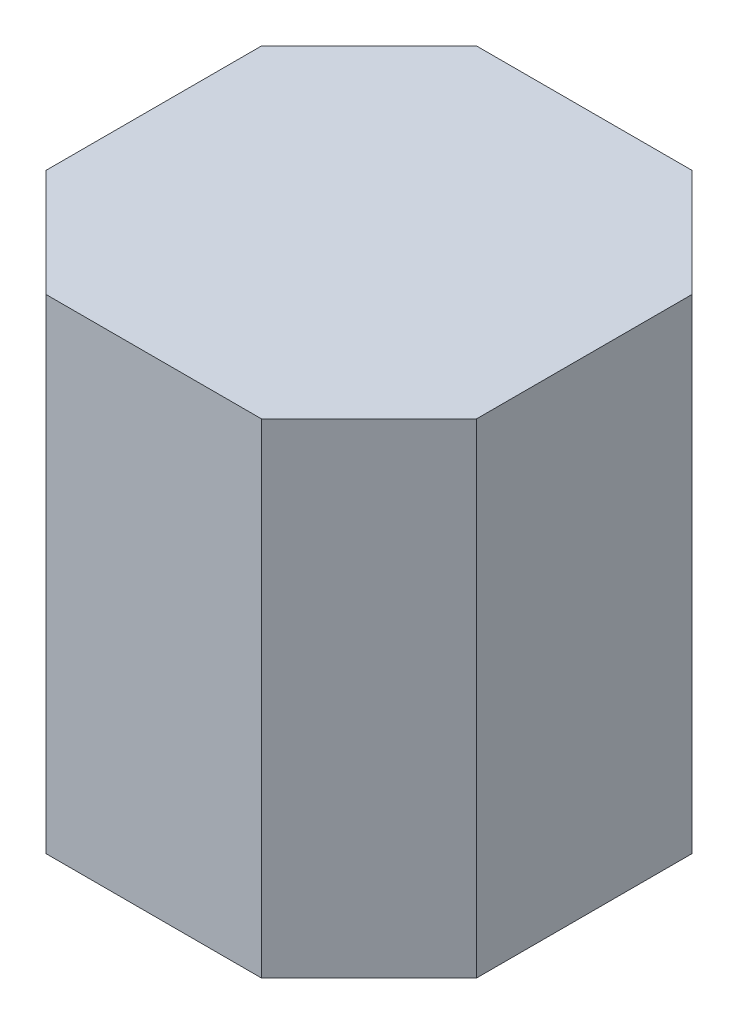
ISO-10303-21;
HEADER;
FILE_DESCRIPTION(('STEP AP214'),'2;1');
FILE_NAME('part.step','',(''),(''),'','','');
FILE_SCHEMA(('AUTOMOTIVE_DESIGN { 1 0 10303 214 1 1 1 1 }'));
ENDSEC;
DATA;
#1=APPLICATION_CONTEXT('core data for automotive mechanical design processes');
#2=APPLICATION_PROTOCOL_DEFINITION('international standard','automotive_design',2000,#1);
#3=PRODUCT_CONTEXT('',#1,'mechanical');
#4=PRODUCT('Part','Part','',(#3));
#5=PRODUCT_RELATED_PRODUCT_CATEGORY('part','',(#4));
#6=PRODUCT_DEFINITION_FORMATION('','',#4);
#7=PRODUCT_DEFINITION_CONTEXT('part definition',#1,'design');
#8=PRODUCT_DEFINITION('design','',#6,#7);
#9=PRODUCT_DEFINITION_SHAPE('','',#8);
#10=(LENGTH_UNIT() NAMED_UNIT(*) SI_UNIT(.MILLI.,.METRE.));
#11=(NAMED_UNIT(*) PLANE_ANGLE_UNIT() SI_UNIT($,.RADIAN.));
#12=(NAMED_UNIT(*) SI_UNIT($,.STERADIAN.) SOLID_ANGLE_UNIT());
#13=UNCERTAINTY_MEASURE_WITH_UNIT(LENGTH_MEASURE(1.E-05),#10,'distance_accuracy_value','');
#14=(GEOMETRIC_REPRESENTATION_CONTEXT(3) GLOBAL_UNCERTAINTY_ASSIGNED_CONTEXT((#13)) GLOBAL_UNIT_ASSIGNED_CONTEXT((#10,
#11,#12)) REPRESENTATION_CONTEXT('',''));
#15=CARTESIAN_POINT('',(0.,0.,0.));
#16=DIRECTION('',(0.,0.,1.));
#17=DIRECTION('',(1.,0.,0.));
#18=AXIS2_PLACEMENT_3D('',#15,#16,#17);
#19=CARTESIAN_POINT('',(-40.,90.,20.));
#20=DIRECTION('',(1.,0.,0.));
#21=DIRECTION('',(0.,0.,-1.));
#22=AXIS2_PLACEMENT_3D('',#19,#20,#21);
#23=PLANE('',#22);
#24=DIRECTION('',(0.,0.,1.));
#25=VECTOR('',#24,1.);
#26=CARTESIAN_POINT('',(-40.,0.,20.));
#27=LINE('',#26,#25);
#28=CARTESIAN_POINT('',(-40.,0.,-20.));
#29=VERTEX_POINT('',#28);
#30=CARTESIAN_POINT('',(-40.,0.,20.));
#31=VERTEX_POINT('',#30);
#32=EDGE_CURVE('E135',#29,#31,#27,.T.);
#33=ORIENTED_EDGE('',*,*,#32,.T.);
#34=DIRECTION('',(0.,-1.,0.));
#35=VECTOR('',#34,1.);
#36=CARTESIAN_POINT('',(-40.,90.,20.));
#37=LINE('',#36,#35);
#38=CARTESIAN_POINT('',(-40.,90.,20.));
#39=VERTEX_POINT('',#38);
#40=EDGE_CURVE('E11',#39,#31,#37,.T.);
#41=ORIENTED_EDGE('',*,*,#40,.F.);
#42=DIRECTION('',(0.,0.,1.));
#43=VECTOR('',#42,1.);
#44=CARTESIAN_POINT('',(-40.,90.,20.));
#45=LINE('',#44,#43);
#46=CARTESIAN_POINT('',(-40.,90.,-20.));
#47=VERTEX_POINT('',#46);
#48=EDGE_CURVE('E150',#47,#39,#45,.T.);
#49=ORIENTED_EDGE('',*,*,#48,.F.);
#50=DIRECTION('',(0.,-1.,0.));
#51=VECTOR('',#50,1.);
#52=CARTESIAN_POINT('',(-40.,90.,-20.));
#53=LINE('',#52,#51);
#54=EDGE_CURVE('E131',#47,#29,#53,.T.);
#55=ORIENTED_EDGE('',*,*,#54,.T.);
#56=EDGE_LOOP('',(#33,#41,#49,#55));
#57=FACE_BOUND('',#56,.T.);
#58=ADVANCED_FACE('F39',(#57),#23,.F.);
#59=CARTESIAN_POINT('',(-20.,90.,40.));
#60=DIRECTION('',(0.707106781186547,0.,-0.707106781186547));
#61=DIRECTION('',(-0.707106781186548,0.,-0.707106781186548));
#62=AXIS2_PLACEMENT_3D('',#59,#60,#61);
#63=PLANE('',#62);
#64=DIRECTION('',(0.707106781186548,0.,0.707106781186548));
#65=VECTOR('',#64,1.);
#66=CARTESIAN_POINT('',(-20.,0.,40.));
#67=LINE('',#66,#65);
#68=CARTESIAN_POINT('',(-20.,0.,40.));
#69=VERTEX_POINT('',#68);
#70=EDGE_CURVE('E138',#31,#69,#67,.T.);
#71=ORIENTED_EDGE('',*,*,#70,.T.);
#72=DIRECTION('',(0.,-1.,0.));
#73=VECTOR('',#72,1.);
#74=CARTESIAN_POINT('',(-20.,90.,40.));
#75=LINE('',#74,#73);
#76=CARTESIAN_POINT('',(-20.,90.,40.));
#77=VERTEX_POINT('',#76);
#78=EDGE_CURVE('E47',#77,#69,#75,.T.);
#79=ORIENTED_EDGE('',*,*,#78,.F.);
#80=DIRECTION('',(0.707106781186548,0.,0.707106781186548));
#81=VECTOR('',#80,1.);
#82=CARTESIAN_POINT('',(-20.,90.,40.));
#83=LINE('',#82,#81);
#84=EDGE_CURVE('E98',#39,#77,#83,.T.);
#85=ORIENTED_EDGE('',*,*,#84,.F.);
#86=ORIENTED_EDGE('',*,*,#40,.T.);
#87=EDGE_LOOP('',(#71,#79,#85,#86));
#88=FACE_BOUND('',#87,.T.);
#89=ADVANCED_FACE('F247',(#88),#63,.F.);
#90=CARTESIAN_POINT('',(20.,90.,40.));
#91=DIRECTION('',(0.,0.,-1.));
#92=DIRECTION('',(-1.,0.,0.));
#93=AXIS2_PLACEMENT_3D('',#90,#91,#92);
#94=PLANE('',#93);
#95=DIRECTION('',(1.,0.,0.));
#96=VECTOR('',#95,1.);
#97=CARTESIAN_POINT('',(20.,0.,40.));
#98=LINE('',#97,#96);
#99=CARTESIAN_POINT('',(20.,0.,40.));
#100=VERTEX_POINT('',#99);
#101=EDGE_CURVE('E141',#69,#100,#98,.T.);
#102=ORIENTED_EDGE('',*,*,#101,.T.);
#103=DIRECTION('',(0.,-1.,0.));
#104=VECTOR('',#103,1.);
#105=CARTESIAN_POINT('',(20.,90.,40.));
#106=LINE('',#105,#104);
#107=CARTESIAN_POINT('',(20.,90.,40.));
#108=VERTEX_POINT('',#107);
#109=EDGE_CURVE('E157',#108,#100,#106,.T.);
#110=ORIENTED_EDGE('',*,*,#109,.F.);
#111=DIRECTION('',(1.,0.,0.));
#112=VECTOR('',#111,1.);
#113=CARTESIAN_POINT('',(20.,90.,40.));
#114=LINE('',#113,#112);
#115=EDGE_CURVE('E165',#77,#108,#114,.T.);
#116=ORIENTED_EDGE('',*,*,#115,.F.);
#117=ORIENTED_EDGE('',*,*,#78,.T.);
#118=EDGE_LOOP('',(#102,#110,#116,#117));
#119=FACE_BOUND('',#118,.T.);
#120=ADVANCED_FACE('F163',(#119),#94,.F.);
#121=CARTESIAN_POINT('',(20.,90.,40.));
#122=DIRECTION('',(-0.707106781186547,0.,-0.707106781186547));
#123=DIRECTION('',(-0.707106781186548,0.,0.707106781186548));
#124=AXIS2_PLACEMENT_3D('',#121,#122,#123);
#125=PLANE('',#124);
#126=DIRECTION('',(0.707106781186548,0.,-0.707106781186548));
#127=VECTOR('',#126,1.);
#128=CARTESIAN_POINT('',(20.,0.,40.));
#129=LINE('',#128,#127);
#130=CARTESIAN_POINT('',(40.,0.,20.));
#131=VERTEX_POINT('',#130);
#132=EDGE_CURVE('E143',#100,#131,#129,.T.);
#133=ORIENTED_EDGE('',*,*,#132,.T.);
#134=DIRECTION('',(0.,-1.,0.));
#135=VECTOR('',#134,1.);
#136=CARTESIAN_POINT('',(40.,90.,20.));
#137=LINE('',#136,#135);
#138=CARTESIAN_POINT('',(40.,90.,20.));
#139=VERTEX_POINT('',#138);
#140=EDGE_CURVE('E154',#139,#131,#137,.T.);
#141=ORIENTED_EDGE('',*,*,#140,.F.);
#142=DIRECTION('',(0.707106781186548,0.,-0.707106781186548));
#143=VECTOR('',#142,1.);
#144=CARTESIAN_POINT('',(20.,90.,40.));
#145=LINE('',#144,#143);
#146=EDGE_CURVE('E177',#108,#139,#145,.T.);
#147=ORIENTED_EDGE('',*,*,#146,.F.);
#148=ORIENTED_EDGE('',*,*,#109,.T.);
#149=EDGE_LOOP('',(#133,#141,#147,#148));
#150=FACE_BOUND('',#149,.T.);
#151=ADVANCED_FACE('F173',(#150),#125,.F.);
#152=CARTESIAN_POINT('',(40.,90.,-20.));
#153=DIRECTION('',(-1.,0.,0.));
#154=DIRECTION('',(0.,0.,1.));
#155=AXIS2_PLACEMENT_3D('',#152,#153,#154);
#156=PLANE('',#155);
#157=DIRECTION('',(0.,0.,-1.));
#158=VECTOR('',#157,1.);
#159=CARTESIAN_POINT('',(40.,0.,-20.));
#160=LINE('',#159,#158);
#161=CARTESIAN_POINT('',(40.,0.,-20.));
#162=VERTEX_POINT('',#161);
#163=EDGE_CURVE('E145',#131,#162,#160,.T.);
#164=ORIENTED_EDGE('',*,*,#163,.T.);
#165=DIRECTION('',(0.,-1.,0.));
#166=VECTOR('',#165,1.);
#167=CARTESIAN_POINT('',(40.,90.,-20.));
#168=LINE('',#167,#166);
#169=CARTESIAN_POINT('',(40.,90.,-20.));
#170=VERTEX_POINT('',#169);
#171=EDGE_CURVE('E126',#170,#162,#168,.T.);
#172=ORIENTED_EDGE('',*,*,#171,.F.);
#173=DIRECTION('',(0.,0.,-1.));
#174=VECTOR('',#173,1.);
#175=CARTESIAN_POINT('',(40.,90.,-20.));
#176=LINE('',#175,#174);
#177=EDGE_CURVE('E117',#139,#170,#176,.T.);
#178=ORIENTED_EDGE('',*,*,#177,.F.);
#179=ORIENTED_EDGE('',*,*,#140,.T.);
#180=EDGE_LOOP('',(#164,#172,#178,#179));
#181=FACE_BOUND('',#180,.T.);
#182=ADVANCED_FACE('F176',(#181),#156,.F.);
#183=CARTESIAN_POINT('',(20.,90.,-40.));
#184=DIRECTION('',(-0.707106781186547,0.,0.707106781186547));
#185=DIRECTION('',(0.707106781186548,0.,0.707106781186548));
#186=AXIS2_PLACEMENT_3D('',#183,#184,#185);
#187=PLANE('',#186);
#188=DIRECTION('',(-0.707106781186548,0.,-0.707106781186548));
#189=VECTOR('',#188,1.);
#190=CARTESIAN_POINT('',(20.,0.,-40.));
#191=LINE('',#190,#189);
#192=CARTESIAN_POINT('',(20.,0.,-40.));
#193=VERTEX_POINT('',#192);
#194=EDGE_CURVE('E125',#162,#193,#191,.T.);
#195=ORIENTED_EDGE('',*,*,#194,.T.);
#196=DIRECTION('',(0.,-1.,0.));
#197=VECTOR('',#196,1.);
#198=CARTESIAN_POINT('',(20.,90.,-40.));
#199=LINE('',#198,#197);
#200=CARTESIAN_POINT('',(20.,90.,-40.));
#201=VERTEX_POINT('',#200);
#202=EDGE_CURVE('E122',#201,#193,#199,.T.);
#203=ORIENTED_EDGE('',*,*,#202,.F.);
#204=DIRECTION('',(-0.707106781186548,0.,-0.707106781186548));
#205=VECTOR('',#204,1.);
#206=CARTESIAN_POINT('',(20.,90.,-40.));
#207=LINE('',#206,#205);
#208=EDGE_CURVE('E111',#170,#201,#207,.T.);
#209=ORIENTED_EDGE('',*,*,#208,.F.);
#210=ORIENTED_EDGE('',*,*,#171,.T.);
#211=EDGE_LOOP('',(#195,#203,#209,#210));
#212=FACE_BOUND('',#211,.T.);
#213=ADVANCED_FACE('F123',(#212),#187,.F.);
#214=CARTESIAN_POINT('',(-20.,90.,-40.));
#215=DIRECTION('',(0.,0.,1.));
#216=DIRECTION('',(1.,0.,0.));
#217=AXIS2_PLACEMENT_3D('',#214,#215,#216);
#218=PLANE('',#217);
#219=DIRECTION('',(-1.,0.,0.));
#220=VECTOR('',#219,1.);
#221=CARTESIAN_POINT('',(-20.,0.,-40.));
#222=LINE('',#221,#220);
#223=CARTESIAN_POINT('',(-20.,0.,-40.));
#224=VERTEX_POINT('',#223);
#225=EDGE_CURVE('E84',#193,#224,#222,.T.);
#226=ORIENTED_EDGE('',*,*,#225,.T.);
#227=DIRECTION('',(0.,-1.,0.));
#228=VECTOR('',#227,1.);
#229=CARTESIAN_POINT('',(-20.,90.,-40.));
#230=LINE('',#229,#228);
#231=CARTESIAN_POINT('',(-20.,90.,-40.));
#232=VERTEX_POINT('',#231);
#233=EDGE_CURVE('E127',#232,#224,#230,.T.);
#234=ORIENTED_EDGE('',*,*,#233,.F.);
#235=DIRECTION('',(-1.,0.,0.));
#236=VECTOR('',#235,1.);
#237=CARTESIAN_POINT('',(-20.,90.,-40.));
#238=LINE('',#237,#236);
#239=EDGE_CURVE('E115',#201,#232,#238,.T.);
#240=ORIENTED_EDGE('',*,*,#239,.F.);
#241=ORIENTED_EDGE('',*,*,#202,.T.);
#242=EDGE_LOOP('',(#226,#234,#240,#241));
#243=FACE_BOUND('',#242,.T.);
#244=ADVANCED_FACE('F129',(#243),#218,.F.);
#245=CARTESIAN_POINT('',(-20.,90.,-40.));
#246=DIRECTION('',(0.707106781186547,0.,0.707106781186547));
#247=DIRECTION('',(0.707106781186548,0.,-0.707106781186548));
#248=AXIS2_PLACEMENT_3D('',#245,#246,#247);
#249=PLANE('',#248);
#250=DIRECTION('',(-0.707106781186548,0.,0.707106781186548));
#251=VECTOR('',#250,1.);
#252=CARTESIAN_POINT('',(-20.,0.,-40.));
#253=LINE('',#252,#251);
#254=EDGE_CURVE('E90',#224,#29,#253,.T.);
#255=ORIENTED_EDGE('',*,*,#254,.T.);
#256=ORIENTED_EDGE('',*,*,#54,.F.);
#257=DIRECTION('',(-0.707106781186548,0.,0.707106781186548));
#258=VECTOR('',#257,1.);
#259=CARTESIAN_POINT('',(-20.,90.,-40.));
#260=LINE('',#259,#258);
#261=EDGE_CURVE('E55',#232,#47,#260,.T.);
#262=ORIENTED_EDGE('',*,*,#261,.F.);
#263=ORIENTED_EDGE('',*,*,#233,.T.);
#264=EDGE_LOOP('',(#255,#256,#262,#263));
#265=FACE_BOUND('',#264,.T.);
#266=ADVANCED_FACE('F254',(#265),#249,.F.);
#267=CARTESIAN_POINT('',(0.,90.,0.));
#268=DIRECTION('',(0.,-1.,0.));
#269=DIRECTION('',(0.,0.,-1.));
#270=AXIS2_PLACEMENT_3D('',#267,#268,#269);
#271=PLANE('',#270);
#272=ORIENTED_EDGE('',*,*,#48,.T.);
#273=ORIENTED_EDGE('',*,*,#84,.T.);
#274=ORIENTED_EDGE('',*,*,#115,.T.);
#275=ORIENTED_EDGE('',*,*,#146,.T.);
#276=ORIENTED_EDGE('',*,*,#177,.T.);
#277=ORIENTED_EDGE('',*,*,#208,.T.);
#278=ORIENTED_EDGE('',*,*,#239,.T.);
#279=ORIENTED_EDGE('',*,*,#261,.T.);
#280=EDGE_LOOP('',(#272,#273,#274,#275,#276,#277,#278,#279));
#281=FACE_BOUND('',#280,.T.);
#282=ADVANCED_FACE('F113',(#281),#271,.F.);
#283=CARTESIAN_POINT('',(0.,0.,0.));
#284=DIRECTION('',(0.,-1.,0.));
#285=DIRECTION('',(0.,0.,-1.));
#286=AXIS2_PLACEMENT_3D('',#283,#284,#285);
#287=PLANE('',#286);
#288=CARTESIAN_POINT('',(-32.,0.,0.));
#289=DIRECTION('',(0.,-1.,0.));
#290=DIRECTION('',(0.,0.,-1.));
#291=AXIS2_PLACEMENT_3D('',#288,#289,#290);
#292=CIRCLE('',#291,2.);
#293=CARTESIAN_POINT('',(-32.,0.,-2.00000000000001));
#294=VERTEX_POINT('',#293);
#295=EDGE_CURVE('E207',#294,#294,#292,.T.);
#296=ORIENTED_EDGE('',*,*,#295,.F.);
#297=EDGE_LOOP('',(#296));
#298=FACE_BOUND('',#297,.T.);
#299=CARTESIAN_POINT('',(0.,0.,-32.));
#300=DIRECTION('',(0.,-1.,0.));
#301=DIRECTION('',(0.,0.,-1.));
#302=AXIS2_PLACEMENT_3D('',#299,#300,#301);
#303=CIRCLE('',#302,2.);
#304=CARTESIAN_POINT('',(0.,0.,-34.));
#305=VERTEX_POINT('',#304);
#306=EDGE_CURVE('E201',#305,#305,#303,.T.);
#307=ORIENTED_EDGE('',*,*,#306,.F.);
#308=EDGE_LOOP('',(#307));
#309=FACE_BOUND('',#308,.T.);
#310=CARTESIAN_POINT('',(32.,0.,0.));
#311=DIRECTION('',(0.,-1.,0.));
#312=DIRECTION('',(0.,0.,-1.));
#313=AXIS2_PLACEMENT_3D('',#310,#311,#312);
#314=CIRCLE('',#313,2.);
#315=CARTESIAN_POINT('',(32.,0.,-2.));
#316=VERTEX_POINT('',#315);
#317=EDGE_CURVE('E195',#316,#316,#314,.T.);
#318=ORIENTED_EDGE('',*,*,#317,.F.);
#319=EDGE_LOOP('',(#318));
#320=FACE_BOUND('',#319,.T.);
#321=CARTESIAN_POINT('',(0.,0.,32.));
#322=DIRECTION('',(0.,-1.,0.));
#323=DIRECTION('',(0.,0.,-1.));
#324=AXIS2_PLACEMENT_3D('',#321,#322,#323);
#325=CIRCLE('',#324,2.);
#326=CARTESIAN_POINT('',(0.,0.,30.));
#327=VERTEX_POINT('',#326);
#328=EDGE_CURVE('E189',#327,#327,#325,.T.);
#329=ORIENTED_EDGE('',*,*,#328,.F.);
#330=EDGE_LOOP('',(#329));
#331=FACE_BOUND('',#330,.T.);
#332=CARTESIAN_POINT('',(0.,0.,0.));
#333=DIRECTION('',(0.,-1.,0.));
#334=DIRECTION('',(0.,0.,-1.));
#335=AXIS2_PLACEMENT_3D('',#332,#333,#334);
#336=CIRCLE('',#335,25.);
#337=CARTESIAN_POINT('',(0.,0.,-25.));
#338=VERTEX_POINT('',#337);
#339=EDGE_CURVE('E183',#338,#338,#336,.T.);
#340=ORIENTED_EDGE('',*,*,#339,.F.);
#341=EDGE_LOOP('',(#340));
#342=FACE_BOUND('',#341,.T.);
#343=ORIENTED_EDGE('',*,*,#32,.F.);
#344=ORIENTED_EDGE('',*,*,#254,.F.);
#345=ORIENTED_EDGE('',*,*,#225,.F.);
#346=ORIENTED_EDGE('',*,*,#194,.F.);
#347=ORIENTED_EDGE('',*,*,#163,.F.);
#348=ORIENTED_EDGE('',*,*,#132,.F.);
#349=ORIENTED_EDGE('',*,*,#101,.F.);
#350=ORIENTED_EDGE('',*,*,#70,.F.);
#351=EDGE_LOOP('',(#343,#344,#345,#346,#347,#348,#349,#350));
#352=FACE_BOUND('',#351,.T.);
#353=ADVANCED_FACE('F169',(#298,#309,#320,#331,#342,#352),#287,.T.);
#354=CARTESIAN_POINT('',(0.,70.,0.));
#355=DIRECTION('',(0.,-1.,0.));
#356=DIRECTION('',(0.,0.,-1.));
#357=AXIS2_PLACEMENT_3D('',#354,#355,#356);
#358=CYLINDRICAL_SURFACE('',#357,25.);
#359=CARTESIAN_POINT('',(0.,70.,0.));
#360=DIRECTION('',(0.,-1.,0.));
#361=DIRECTION('',(0.,0.,-1.));
#362=AXIS2_PLACEMENT_3D('',#359,#360,#361);
#363=CIRCLE('',#362,25.);
#364=CARTESIAN_POINT('',(0.,70.,-25.));
#365=VERTEX_POINT('',#364);
#366=EDGE_CURVE('E139',#365,#365,#363,.T.);
#367=ORIENTED_EDGE('',*,*,#366,.F.);
#368=EDGE_LOOP('',(#367));
#369=FACE_BOUND('',#368,.T.);
#370=ORIENTED_EDGE('',*,*,#339,.T.);
#371=EDGE_LOOP('',(#370));
#372=FACE_BOUND('',#371,.T.);
#373=ADVANCED_FACE('F224',(#369,#372),#358,.F.);
#374=CARTESIAN_POINT('',(0.,70.,0.));
#375=DIRECTION('',(0.,-1.,0.));
#376=DIRECTION('',(0.,0.,-1.));
#377=AXIS2_PLACEMENT_3D('',#374,#375,#376);
#378=PLANE('',#377);
#379=ORIENTED_EDGE('',*,*,#366,.T.);
#380=EDGE_LOOP('',(#379));
#381=FACE_BOUND('',#380,.T.);
#382=ADVANCED_FACE('F235',(#381),#378,.T.);
#383=CARTESIAN_POINT('',(0.,15.,32.));
#384=DIRECTION('',(0.,-1.,0.));
#385=DIRECTION('',(0.,0.,-1.));
#386=AXIS2_PLACEMENT_3D('',#383,#384,#385);
#387=CYLINDRICAL_SURFACE('',#386,2.);
#388=CARTESIAN_POINT('',(0.,15.,32.));
#389=DIRECTION('',(0.,-1.,0.));
#390=DIRECTION('',(0.,0.,-1.));
#391=AXIS2_PLACEMENT_3D('',#388,#389,#390);
#392=CIRCLE('',#391,2.);
#393=CARTESIAN_POINT('',(0.,15.,30.));
#394=VERTEX_POINT('',#393);
#395=EDGE_CURVE('E192',#394,#394,#392,.T.);
#396=ORIENTED_EDGE('',*,*,#395,.F.);
#397=EDGE_LOOP('',(#396));
#398=FACE_BOUND('',#397,.T.);
#399=ORIENTED_EDGE('',*,*,#328,.T.);
#400=EDGE_LOOP('',(#399));
#401=FACE_BOUND('',#400,.T.);
#402=ADVANCED_FACE('F241',(#398,#401),#387,.F.);
#403=CARTESIAN_POINT('',(0.,15.,32.));
#404=DIRECTION('',(0.,-1.,0.));
#405=DIRECTION('',(0.,0.,-1.));
#406=AXIS2_PLACEMENT_3D('',#403,#404,#405);
#407=PLANE('',#406);
#408=ORIENTED_EDGE('',*,*,#395,.T.);
#409=EDGE_LOOP('',(#408));
#410=FACE_BOUND('',#409,.T.);
#411=ADVANCED_FACE('F327',(#410),#407,.T.);
#412=CARTESIAN_POINT('',(32.,15.,0.));
#413=DIRECTION('',(0.,-1.,0.));
#414=DIRECTION('',(0.,0.,-1.));
#415=AXIS2_PLACEMENT_3D('',#412,#413,#414);
#416=CYLINDRICAL_SURFACE('',#415,2.);
#417=CARTESIAN_POINT('',(32.,15.,0.));
#418=DIRECTION('',(0.,-1.,0.));
#419=DIRECTION('',(0.,0.,-1.));
#420=AXIS2_PLACEMENT_3D('',#417,#418,#419);
#421=CIRCLE('',#420,2.);
#422=CARTESIAN_POINT('',(32.,15.,-2.));
#423=VERTEX_POINT('',#422);
#424=EDGE_CURVE('E198',#423,#423,#421,.T.);
#425=ORIENTED_EDGE('',*,*,#424,.F.);
#426=EDGE_LOOP('',(#425));
#427=FACE_BOUND('',#426,.T.);
#428=ORIENTED_EDGE('',*,*,#317,.T.);
#429=EDGE_LOOP('',(#428));
#430=FACE_BOUND('',#429,.T.);
#431=ADVANCED_FACE('F337',(#427,#430),#416,.F.);
#432=CARTESIAN_POINT('',(32.,15.,0.));
#433=DIRECTION('',(0.,-1.,0.));
#434=DIRECTION('',(0.,0.,-1.));
#435=AXIS2_PLACEMENT_3D('',#432,#433,#434);
#436=PLANE('',#435);
#437=ORIENTED_EDGE('',*,*,#424,.T.);
#438=EDGE_LOOP('',(#437));
#439=FACE_BOUND('',#438,.T.);
#440=ADVANCED_FACE('F347',(#439),#436,.T.);
#441=CARTESIAN_POINT('',(0.,15.,-32.));
#442=DIRECTION('',(0.,-1.,0.));
#443=DIRECTION('',(0.,0.,-1.));
#444=AXIS2_PLACEMENT_3D('',#441,#442,#443);
#445=CYLINDRICAL_SURFACE('',#444,2.);
#446=CARTESIAN_POINT('',(0.,15.,-32.));
#447=DIRECTION('',(0.,-1.,0.));
#448=DIRECTION('',(0.,0.,-1.));
#449=AXIS2_PLACEMENT_3D('',#446,#447,#448);
#450=CIRCLE('',#449,2.);
#451=CARTESIAN_POINT('',(0.,15.,-34.));
#452=VERTEX_POINT('',#451);
#453=EDGE_CURVE('E204',#452,#452,#450,.T.);
#454=ORIENTED_EDGE('',*,*,#453,.F.);
#455=EDGE_LOOP('',(#454));
#456=FACE_BOUND('',#455,.T.);
#457=ORIENTED_EDGE('',*,*,#306,.T.);
#458=EDGE_LOOP('',(#457));
#459=FACE_BOUND('',#458,.T.);
#460=ADVANCED_FACE('F357',(#456,#459),#445,.F.);
#461=CARTESIAN_POINT('',(0.,15.,-32.));
#462=DIRECTION('',(0.,-1.,0.));
#463=DIRECTION('',(0.,0.,-1.));
#464=AXIS2_PLACEMENT_3D('',#461,#462,#463);
#465=PLANE('',#464);
#466=ORIENTED_EDGE('',*,*,#453,.T.);
#467=EDGE_LOOP('',(#466));
#468=FACE_BOUND('',#467,.T.);
#469=ADVANCED_FACE('F218',(#468),#465,.T.);
#470=CARTESIAN_POINT('',(-32.,15.,0.));
#471=DIRECTION('',(0.,-1.,0.));
#472=DIRECTION('',(0.,0.,-1.));
#473=AXIS2_PLACEMENT_3D('',#470,#471,#472);
#474=CYLINDRICAL_SURFACE('',#473,2.);
#475=CARTESIAN_POINT('',(-32.,15.,0.));
#476=DIRECTION('',(0.,-1.,0.));
#477=DIRECTION('',(0.,0.,-1.));
#478=AXIS2_PLACEMENT_3D('',#475,#476,#477);
#479=CIRCLE('',#478,2.);
#480=CARTESIAN_POINT('',(-32.,15.,-2.00000000000001));
#481=VERTEX_POINT('',#480);
#482=EDGE_CURVE('E186',#481,#481,#479,.T.);
#483=ORIENTED_EDGE('',*,*,#482,.F.);
#484=EDGE_LOOP('',(#483));
#485=FACE_BOUND('',#484,.T.);
#486=ORIENTED_EDGE('',*,*,#295,.T.);
#487=EDGE_LOOP('',(#486));
#488=FACE_BOUND('',#487,.T.);
#489=ADVANCED_FACE('F215',(#485,#488),#474,.F.);
#490=CARTESIAN_POINT('',(-32.,15.,0.));
#491=DIRECTION('',(0.,-1.,0.));
#492=DIRECTION('',(0.,0.,-1.));
#493=AXIS2_PLACEMENT_3D('',#490,#491,#492);
#494=PLANE('',#493);
#495=ORIENTED_EDGE('',*,*,#482,.T.);
#496=EDGE_LOOP('',(#495));
#497=FACE_BOUND('',#496,.T.);
#498=ADVANCED_FACE('F213',(#497),#494,.T.);
#499=CLOSED_SHELL('',(#58,#89,#120,#151,#182,#213,#244,#266,#282,#353,#373,#382,#402,#411,#431,
#440,#460,#469,#489,#498));
#500=MANIFOLD_SOLID_BREP('B2',#499);
#501=ADVANCED_BREP_SHAPE_REPRESENTATION('',(#18,#500),#14);
#502=SHAPE_DEFINITION_REPRESENTATION(#9,#501);
ENDSEC;
END-ISO-10303-21;
